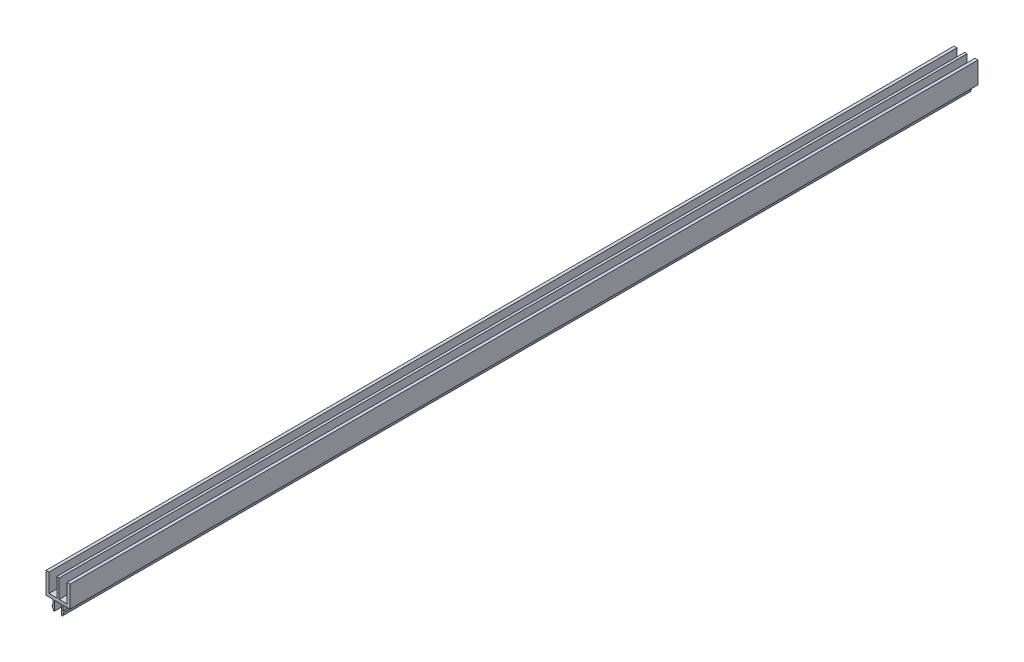
ISO-10303-21;
HEADER;
FILE_DESCRIPTION(('STEP AP214'),'2;1');
FILE_NAME('part.step','',(''),(''),'','','');
FILE_SCHEMA(('AUTOMOTIVE_DESIGN { 1 0 10303 214 1 1 1 1 }'));
ENDSEC;
DATA;
#1=APPLICATION_CONTEXT('core data for automotive mechanical design processes');
#2=APPLICATION_PROTOCOL_DEFINITION('international standard','automotive_design',2000,#1);
#3=PRODUCT_CONTEXT('',#1,'mechanical');
#4=PRODUCT('Part','Part','',(#3));
#5=PRODUCT_RELATED_PRODUCT_CATEGORY('part','',(#4));
#6=PRODUCT_DEFINITION_FORMATION('','',#4);
#7=PRODUCT_DEFINITION_CONTEXT('part definition',#1,'design');
#8=PRODUCT_DEFINITION('design','',#6,#7);
#9=PRODUCT_DEFINITION_SHAPE('','',#8);
#10=(LENGTH_UNIT() NAMED_UNIT(*) SI_UNIT(.MILLI.,.METRE.));
#11=(NAMED_UNIT(*) PLANE_ANGLE_UNIT() SI_UNIT($,.RADIAN.));
#12=(NAMED_UNIT(*) SI_UNIT($,.STERADIAN.) SOLID_ANGLE_UNIT());
#13=UNCERTAINTY_MEASURE_WITH_UNIT(LENGTH_MEASURE(1.E-05),#10,'distance_accuracy_value','');
#14=(GEOMETRIC_REPRESENTATION_CONTEXT(3) GLOBAL_UNCERTAINTY_ASSIGNED_CONTEXT((#13)) GLOBAL_UNIT_ASSIGNED_CONTEXT((#10,
#11,#12)) REPRESENTATION_CONTEXT('',''));
#15=CARTESIAN_POINT('',(0.,0.,0.));
#16=DIRECTION('',(0.,0.,1.));
#17=DIRECTION('',(1.,0.,0.));
#18=AXIS2_PLACEMENT_3D('',#15,#16,#17);
#19=CARTESIAN_POINT('',(-1.,17.9999999975,-706.));
#20=DIRECTION('',(-1.,0.,0.));
#21=DIRECTION('',(0.,-1.,0.));
#22=AXIS2_PLACEMENT_3D('',#19,#20,#21);
#23=PLANE('',#22);
#24=DIRECTION('',(0.,-1.,0.));
#25=VECTOR('',#24,1.);
#26=CARTESIAN_POINT('',(-1.,17.9999999975,50.));
#27=LINE('',#26,#25);
#28=CARTESIAN_POINT('',(-1.,17.9999999975,50.));
#29=VERTEX_POINT('',#28);
#30=CARTESIAN_POINT('',(-1.,2.4999999995,50.));
#31=VERTEX_POINT('',#30);
#32=EDGE_CURVE('E226',#29,#31,#27,.T.);
#33=ORIENTED_EDGE('',*,*,#32,.F.);
#34=DIRECTION('',(0.,0.,1.));
#35=VECTOR('',#34,1.);
#36=CARTESIAN_POINT('',(-1.,17.9999999975,-706.));
#37=LINE('',#36,#35);
#38=CARTESIAN_POINT('',(-1.,17.9999999975,-706.));
#39=VERTEX_POINT('',#38);
#40=EDGE_CURVE('E11',#39,#29,#37,.T.);
#41=ORIENTED_EDGE('',*,*,#40,.F.);
#42=DIRECTION('',(0.,-1.,0.));
#43=VECTOR('',#42,1.);
#44=CARTESIAN_POINT('',(-1.,17.9999999975,-706.));
#45=LINE('',#44,#43);
#46=CARTESIAN_POINT('',(-1.,2.4999999995,-706.));
#47=VERTEX_POINT('',#46);
#48=EDGE_CURVE('E294',#39,#47,#45,.T.);
#49=ORIENTED_EDGE('',*,*,#48,.T.);
#50=DIRECTION('',(0.,0.,1.));
#51=VECTOR('',#50,1.);
#52=CARTESIAN_POINT('',(-1.,2.4999999995,-706.));
#53=LINE('',#52,#51);
#54=EDGE_CURVE('E36',#47,#31,#53,.T.);
#55=ORIENTED_EDGE('',*,*,#54,.T.);
#56=EDGE_LOOP('',(#33,#41,#49,#55));
#57=FACE_BOUND('',#56,.T.);
#58=ADVANCED_FACE('F33',(#57),#23,.T.);
#59=CARTESIAN_POINT('',(0.999999999999998,17.9999999975,-706.));
#60=DIRECTION('',(0.,1.,0.));
#61=DIRECTION('',(0.,0.,1.));
#62=AXIS2_PLACEMENT_3D('',#59,#60,#61);
#63=PLANE('',#62);
#64=DIRECTION('',(-1.,0.,0.));
#65=VECTOR('',#64,1.);
#66=CARTESIAN_POINT('',(0.999999999999998,17.9999999975,50.));
#67=LINE('',#66,#65);
#68=CARTESIAN_POINT('',(0.999999999999998,17.9999999975,50.));
#69=VERTEX_POINT('',#68);
#70=EDGE_CURVE('E292',#69,#29,#67,.T.);
#71=ORIENTED_EDGE('',*,*,#70,.F.);
#72=DIRECTION('',(0.,0.,1.));
#73=VECTOR('',#72,1.);
#74=CARTESIAN_POINT('',(0.999999999999998,17.9999999975,-706.));
#75=LINE('',#74,#73);
#76=CARTESIAN_POINT('',(0.999999999999998,17.9999999975,-706.));
#77=VERTEX_POINT('',#76);
#78=EDGE_CURVE('E42',#77,#69,#75,.T.);
#79=ORIENTED_EDGE('',*,*,#78,.F.);
#80=DIRECTION('',(-1.,0.,0.));
#81=VECTOR('',#80,1.);
#82=CARTESIAN_POINT('',(0.999999999999998,17.9999999975,-706.));
#83=LINE('',#82,#81);
#84=EDGE_CURVE('E216',#77,#39,#83,.T.);
#85=ORIENTED_EDGE('',*,*,#84,.T.);
#86=ORIENTED_EDGE('',*,*,#40,.T.);
#87=EDGE_LOOP('',(#71,#79,#85,#86));
#88=FACE_BOUND('',#87,.T.);
#89=ADVANCED_FACE('F338',(#88),#63,.T.);
#90=CARTESIAN_POINT('',(0.999999999999998,2.4999999995,-706.));
#91=DIRECTION('',(1.,0.,0.));
#92=DIRECTION('',(0.,0.,-1.));
#93=AXIS2_PLACEMENT_3D('',#90,#91,#92);
#94=PLANE('',#93);
#95=DIRECTION('',(0.,1.,0.));
#96=VECTOR('',#95,1.);
#97=CARTESIAN_POINT('',(0.999999999999998,2.4999999995,50.));
#98=LINE('',#97,#96);
#99=CARTESIAN_POINT('',(0.999999999999998,2.4999999995,50.));
#100=VERTEX_POINT('',#99);
#101=EDGE_CURVE('E203',#100,#69,#98,.T.);
#102=ORIENTED_EDGE('',*,*,#101,.F.);
#103=DIRECTION('',(0.,0.,1.));
#104=VECTOR('',#103,1.);
#105=CARTESIAN_POINT('',(0.999999999999998,2.4999999995,-706.));
#106=LINE('',#105,#104);
#107=CARTESIAN_POINT('',(0.999999999999998,2.4999999995,-706.));
#108=VERTEX_POINT('',#107);
#109=EDGE_CURVE('E198',#108,#100,#106,.T.);
#110=ORIENTED_EDGE('',*,*,#109,.F.);
#111=DIRECTION('',(0.,1.,0.));
#112=VECTOR('',#111,1.);
#113=CARTESIAN_POINT('',(0.999999999999998,2.4999999995,-706.));
#114=LINE('',#113,#112);
#115=EDGE_CURVE('E201',#108,#77,#114,.T.);
#116=ORIENTED_EDGE('',*,*,#115,.T.);
#117=ORIENTED_EDGE('',*,*,#78,.T.);
#118=EDGE_LOOP('',(#102,#110,#116,#117));
#119=FACE_BOUND('',#118,.T.);
#120=ADVANCED_FACE('F200',(#119),#94,.T.);
#121=CARTESIAN_POINT('',(7.5,2.4999999995,-706.));
#122=DIRECTION('',(0.,1.,0.));
#123=DIRECTION('',(-1.,0.,0.));
#124=AXIS2_PLACEMENT_3D('',#121,#122,#123);
#125=PLANE('',#124);
#126=DIRECTION('',(-1.,0.,0.));
#127=VECTOR('',#126,1.);
#128=CARTESIAN_POINT('',(7.5,2.4999999995,50.));
#129=LINE('',#128,#127);
#130=CARTESIAN_POINT('',(7.5,2.4999999995,50.));
#131=VERTEX_POINT('',#130);
#132=EDGE_CURVE('E289',#131,#100,#129,.T.);
#133=ORIENTED_EDGE('',*,*,#132,.F.);
#134=DIRECTION('',(0.,0.,1.));
#135=VECTOR('',#134,1.);
#136=CARTESIAN_POINT('',(7.5,2.4999999995,-706.));
#137=LINE('',#136,#135);
#138=CARTESIAN_POINT('',(7.5,2.4999999995,-706.));
#139=VERTEX_POINT('',#138);
#140=EDGE_CURVE('E208',#139,#131,#137,.T.);
#141=ORIENTED_EDGE('',*,*,#140,.F.);
#142=DIRECTION('',(-1.,0.,0.));
#143=VECTOR('',#142,1.);
#144=CARTESIAN_POINT('',(7.5,2.4999999995,-706.));
#145=LINE('',#144,#143);
#146=EDGE_CURVE('E214',#139,#108,#145,.T.);
#147=ORIENTED_EDGE('',*,*,#146,.T.);
#148=ORIENTED_EDGE('',*,*,#109,.T.);
#149=EDGE_LOOP('',(#133,#141,#147,#148));
#150=FACE_BOUND('',#149,.T.);
#151=ADVANCED_FACE('F218',(#150),#125,.T.);
#152=CARTESIAN_POINT('',(7.5,17.9999999975,-706.));
#153=DIRECTION('',(-1.,0.,0.));
#154=DIRECTION('',(0.,-1.,0.));
#155=AXIS2_PLACEMENT_3D('',#152,#153,#154);
#156=PLANE('',#155);
#157=DIRECTION('',(0.,-1.,0.));
#158=VECTOR('',#157,1.);
#159=CARTESIAN_POINT('',(7.5,17.9999999975,50.));
#160=LINE('',#159,#158);
#161=CARTESIAN_POINT('',(7.5,17.9999999975,50.));
#162=VERTEX_POINT('',#161);
#163=EDGE_CURVE('E286',#162,#131,#160,.T.);
#164=ORIENTED_EDGE('',*,*,#163,.F.);
#165=DIRECTION('',(0.,0.,1.));
#166=VECTOR('',#165,1.);
#167=CARTESIAN_POINT('',(7.5,17.9999999975,-706.));
#168=LINE('',#167,#166);
#169=CARTESIAN_POINT('',(7.5,17.9999999975,-706.));
#170=VERTEX_POINT('',#169);
#171=EDGE_CURVE('E298',#170,#162,#168,.T.);
#172=ORIENTED_EDGE('',*,*,#171,.F.);
#173=DIRECTION('',(0.,-1.,0.));
#174=VECTOR('',#173,1.);
#175=CARTESIAN_POINT('',(7.5,17.9999999975,-706.));
#176=LINE('',#175,#174);
#177=EDGE_CURVE('E219',#170,#139,#176,.T.);
#178=ORIENTED_EDGE('',*,*,#177,.T.);
#179=ORIENTED_EDGE('',*,*,#140,.T.);
#180=EDGE_LOOP('',(#164,#172,#178,#179));
#181=FACE_BOUND('',#180,.T.);
#182=ADVANCED_FACE('F351',(#181),#156,.T.);
#183=CARTESIAN_POINT('',(10.,17.9999999975,-706.));
#184=DIRECTION('',(0.,1.,0.));
#185=DIRECTION('',(0.,0.,1.));
#186=AXIS2_PLACEMENT_3D('',#183,#184,#185);
#187=PLANE('',#186);
#188=DIRECTION('',(-1.,0.,0.));
#189=VECTOR('',#188,1.);
#190=CARTESIAN_POINT('',(10.,17.9999999975,50.));
#191=LINE('',#190,#189);
#192=CARTESIAN_POINT('',(10.,17.9999999975,50.));
#193=VERTEX_POINT('',#192);
#194=EDGE_CURVE('E283',#193,#162,#191,.T.);
#195=ORIENTED_EDGE('',*,*,#194,.F.);
#196=DIRECTION('',(0.,0.,1.));
#197=VECTOR('',#196,1.);
#198=CARTESIAN_POINT('',(10.,17.9999999975,-706.));
#199=LINE('',#198,#197);
#200=CARTESIAN_POINT('',(10.,17.9999999975,-706.));
#201=VERTEX_POINT('',#200);
#202=EDGE_CURVE('E300',#201,#193,#199,.T.);
#203=ORIENTED_EDGE('',*,*,#202,.F.);
#204=DIRECTION('',(-1.,0.,0.));
#205=VECTOR('',#204,1.);
#206=CARTESIAN_POINT('',(10.,17.9999999975,-706.));
#207=LINE('',#206,#205);
#208=EDGE_CURVE('E221',#201,#170,#207,.T.);
#209=ORIENTED_EDGE('',*,*,#208,.T.);
#210=ORIENTED_EDGE('',*,*,#171,.T.);
#211=EDGE_LOOP('',(#195,#203,#209,#210));
#212=FACE_BOUND('',#211,.T.);
#213=ADVANCED_FACE('F354',(#212),#187,.T.);
#214=CARTESIAN_POINT('',(10.,-4.99999828349541E-10,-706.));
#215=DIRECTION('',(1.,0.,0.));
#216=DIRECTION('',(0.,0.,-1.));
#217=AXIS2_PLACEMENT_3D('',#214,#215,#216);
#218=PLANE('',#217);
#219=DIRECTION('',(0.,1.,0.));
#220=VECTOR('',#219,1.);
#221=CARTESIAN_POINT('',(10.,-4.99999828349541E-10,50.));
#222=LINE('',#221,#220);
#223=CARTESIAN_POINT('',(10.,-4.99999828349541E-10,50.));
#224=VERTEX_POINT('',#223);
#225=EDGE_CURVE('E280',#224,#193,#222,.T.);
#226=ORIENTED_EDGE('',*,*,#225,.F.);
#227=DIRECTION('',(0.,0.,1.));
#228=VECTOR('',#227,1.);
#229=CARTESIAN_POINT('',(10.,-4.99999828349541E-10,-706.));
#230=LINE('',#229,#228);
#231=CARTESIAN_POINT('',(10.,-4.99999828349541E-10,-706.));
#232=VERTEX_POINT('',#231);
#233=EDGE_CURVE('E302',#232,#224,#230,.T.);
#234=ORIENTED_EDGE('',*,*,#233,.F.);
#235=DIRECTION('',(0.,1.,0.));
#236=VECTOR('',#235,1.);
#237=CARTESIAN_POINT('',(10.,-4.99999828349541E-10,-706.));
#238=LINE('',#237,#236);
#239=EDGE_CURVE('E644',#232,#201,#238,.T.);
#240=ORIENTED_EDGE('',*,*,#239,.T.);
#241=ORIENTED_EDGE('',*,*,#202,.T.);
#242=EDGE_LOOP('',(#226,#234,#240,#241));
#243=FACE_BOUND('',#242,.T.);
#244=ADVANCED_FACE('F358',(#243),#218,.T.);
#245=CARTESIAN_POINT('',(4.,-4.99999998002099E-10,-706.));
#246=DIRECTION('',(0.,-1.,0.));
#247=DIRECTION('',(1.,0.,0.));
#248=AXIS2_PLACEMENT_3D('',#245,#246,#247);
#249=PLANE('',#248);
#250=DIRECTION('',(1.,0.,0.));
#251=VECTOR('',#250,1.);
#252=CARTESIAN_POINT('',(4.,-4.99999998002099E-10,50.));
#253=LINE('',#252,#251);
#254=CARTESIAN_POINT('',(4.,-4.99999998002099E-10,50.));
#255=VERTEX_POINT('',#254);
#256=EDGE_CURVE('E277',#255,#224,#253,.T.);
#257=ORIENTED_EDGE('',*,*,#256,.F.);
#258=DIRECTION('',(0.,0.,1.));
#259=VECTOR('',#258,1.);
#260=CARTESIAN_POINT('',(4.,-4.99999998002099E-10,-706.));
#261=LINE('',#260,#259);
#262=CARTESIAN_POINT('',(4.,-4.99999998002099E-10,-706.));
#263=VERTEX_POINT('',#262);
#264=EDGE_CURVE('E304',#263,#255,#261,.T.);
#265=ORIENTED_EDGE('',*,*,#264,.F.);
#266=DIRECTION('',(1.,0.,0.));
#267=VECTOR('',#266,1.);
#268=CARTESIAN_POINT('',(4.,-4.99999998002099E-10,-706.));
#269=LINE('',#268,#267);
#270=EDGE_CURVE('E648',#263,#232,#269,.T.);
#271=ORIENTED_EDGE('',*,*,#270,.T.);
#272=ORIENTED_EDGE('',*,*,#233,.T.);
#273=EDGE_LOOP('',(#257,#265,#271,#272));
#274=FACE_BOUND('',#273,.T.);
#275=ADVANCED_FACE('F362',(#274),#249,.T.);
#276=CARTESIAN_POINT('',(4.,-4.5,-706.));
#277=DIRECTION('',(1.,0.,0.));
#278=DIRECTION('',(0.,0.,-1.));
#279=AXIS2_PLACEMENT_3D('',#276,#277,#278);
#280=PLANE('',#279);
#281=DIRECTION('',(0.,1.,0.));
#282=VECTOR('',#281,1.);
#283=CARTESIAN_POINT('',(4.,-4.5,50.));
#284=LINE('',#283,#282);
#285=CARTESIAN_POINT('',(4.,-4.5,50.));
#286=VERTEX_POINT('',#285);
#287=EDGE_CURVE('E274',#286,#255,#284,.T.);
#288=ORIENTED_EDGE('',*,*,#287,.F.);
#289=DIRECTION('',(0.,0.,1.));
#290=VECTOR('',#289,1.);
#291=CARTESIAN_POINT('',(4.,-4.5,-706.));
#292=LINE('',#291,#290);
#293=CARTESIAN_POINT('',(4.,-4.5,-706.));
#294=VERTEX_POINT('',#293);
#295=EDGE_CURVE('E306',#294,#286,#292,.T.);
#296=ORIENTED_EDGE('',*,*,#295,.F.);
#297=DIRECTION('',(0.,1.,0.));
#298=VECTOR('',#297,1.);
#299=CARTESIAN_POINT('',(4.,-4.5,-706.));
#300=LINE('',#299,#298);
#301=EDGE_CURVE('E637',#294,#263,#300,.T.);
#302=ORIENTED_EDGE('',*,*,#301,.T.);
#303=ORIENTED_EDGE('',*,*,#264,.T.);
#304=EDGE_LOOP('',(#288,#296,#302,#303));
#305=FACE_BOUND('',#304,.T.);
#306=ADVANCED_FACE('F366',(#305),#280,.T.);
#307=CARTESIAN_POINT('',(5.,-4.5,-706.));
#308=DIRECTION('',(0.,1.,0.));
#309=DIRECTION('',(0.,0.,1.));
#310=AXIS2_PLACEMENT_3D('',#307,#308,#309);
#311=PLANE('',#310);
#312=DIRECTION('',(-1.,0.,0.));
#313=VECTOR('',#312,1.);
#314=CARTESIAN_POINT('',(5.,-4.5,50.));
#315=LINE('',#314,#313);
#316=CARTESIAN_POINT('',(5.,-4.5,50.));
#317=VERTEX_POINT('',#316);
#318=EDGE_CURVE('E271',#317,#286,#315,.T.);
#319=ORIENTED_EDGE('',*,*,#318,.F.);
#320=DIRECTION('',(0.,0.,1.));
#321=VECTOR('',#320,1.);
#322=CARTESIAN_POINT('',(5.,-4.5,-706.));
#323=LINE('',#322,#321);
#324=CARTESIAN_POINT('',(5.,-4.5,-706.));
#325=VERTEX_POINT('',#324);
#326=EDGE_CURVE('E308',#325,#317,#323,.T.);
#327=ORIENTED_EDGE('',*,*,#326,.F.);
#328=DIRECTION('',(-1.,0.,0.));
#329=VECTOR('',#328,1.);
#330=CARTESIAN_POINT('',(5.,-4.5,-706.));
#331=LINE('',#330,#329);
#332=EDGE_CURVE('E633',#325,#294,#331,.T.);
#333=ORIENTED_EDGE('',*,*,#332,.T.);
#334=ORIENTED_EDGE('',*,*,#295,.T.);
#335=EDGE_LOOP('',(#319,#327,#333,#334));
#336=FACE_BOUND('',#335,.T.);
#337=ADVANCED_FACE('F370',(#336),#311,.T.);
#338=CARTESIAN_POINT('',(3.75,-8.,-706.));
#339=DIRECTION('',(0.941741911594837,-0.336336396998156,0.));
#340=DIRECTION('',(0.336336396998157,0.941741911594838,0.));
#341=AXIS2_PLACEMENT_3D('',#338,#339,#340);
#342=PLANE('',#341);
#343=DIRECTION('',(0.336336396998157,0.941741911594837,0.));
#344=VECTOR('',#343,1.);
#345=CARTESIAN_POINT('',(3.75,-8.,50.));
#346=LINE('',#345,#344);
#347=CARTESIAN_POINT('',(3.75,-8.,50.));
#348=VERTEX_POINT('',#347);
#349=EDGE_CURVE('E268',#348,#317,#346,.T.);
#350=ORIENTED_EDGE('',*,*,#349,.F.);
#351=DIRECTION('',(0.,0.,1.));
#352=VECTOR('',#351,1.);
#353=CARTESIAN_POINT('',(3.75,-8.,-706.));
#354=LINE('',#353,#352);
#355=CARTESIAN_POINT('',(3.75,-8.,-706.));
#356=VERTEX_POINT('',#355);
#357=EDGE_CURVE('E310',#356,#348,#354,.T.);
#358=ORIENTED_EDGE('',*,*,#357,.F.);
#359=DIRECTION('',(0.336336396998157,0.941741911594837,0.));
#360=VECTOR('',#359,1.);
#361=CARTESIAN_POINT('',(3.75,-8.,-706.));
#362=LINE('',#361,#360);
#363=EDGE_CURVE('E654',#356,#325,#362,.T.);
#364=ORIENTED_EDGE('',*,*,#363,.T.);
#365=ORIENTED_EDGE('',*,*,#326,.T.);
#366=EDGE_LOOP('',(#350,#358,#364,#365));
#367=FACE_BOUND('',#366,.T.);
#368=ADVANCED_FACE('F374',(#367),#342,.T.);
#369=CARTESIAN_POINT('',(3.,-8.,-706.));
#370=DIRECTION('',(0.,-1.,0.));
#371=DIRECTION('',(0.,0.,-1.));
#372=AXIS2_PLACEMENT_3D('',#369,#370,#371);
#373=PLANE('',#372);
#374=DIRECTION('',(1.,0.,0.));
#375=VECTOR('',#374,1.);
#376=CARTESIAN_POINT('',(3.,-8.,50.));
#377=LINE('',#376,#375);
#378=CARTESIAN_POINT('',(3.,-8.,50.));
#379=VERTEX_POINT('',#378);
#380=EDGE_CURVE('E265',#379,#348,#377,.T.);
#381=ORIENTED_EDGE('',*,*,#380,.F.);
#382=DIRECTION('',(0.,0.,1.));
#383=VECTOR('',#382,1.);
#384=CARTESIAN_POINT('',(3.,-8.,-706.));
#385=LINE('',#384,#383);
#386=CARTESIAN_POINT('',(3.,-8.,-706.));
#387=VERTEX_POINT('',#386);
#388=EDGE_CURVE('E312',#387,#379,#385,.T.);
#389=ORIENTED_EDGE('',*,*,#388,.F.);
#390=DIRECTION('',(1.,0.,0.));
#391=VECTOR('',#390,1.);
#392=CARTESIAN_POINT('',(3.,-8.,-706.));
#393=LINE('',#392,#391);
#394=EDGE_CURVE('E626',#387,#356,#393,.T.);
#395=ORIENTED_EDGE('',*,*,#394,.T.);
#396=ORIENTED_EDGE('',*,*,#357,.T.);
#397=EDGE_LOOP('',(#381,#389,#395,#396));
#398=FACE_BOUND('',#397,.T.);
#399=ADVANCED_FACE('F378',(#398),#373,.T.);
#400=CARTESIAN_POINT('',(3.,-4.9999985194348E-10,-706.));
#401=DIRECTION('',(-1.,0.,0.));
#402=DIRECTION('',(0.,0.,1.));
#403=AXIS2_PLACEMENT_3D('',#400,#401,#402);
#404=PLANE('',#403);
#405=DIRECTION('',(0.,-1.,0.));
#406=VECTOR('',#405,1.);
#407=CARTESIAN_POINT('',(3.,-4.9999985194348E-10,50.));
#408=LINE('',#407,#406);
#409=CARTESIAN_POINT('',(3.,-4.9999985194348E-10,50.));
#410=VERTEX_POINT('',#409);
#411=EDGE_CURVE('E262',#410,#379,#408,.T.);
#412=ORIENTED_EDGE('',*,*,#411,.F.);
#413=DIRECTION('',(0.,0.,1.));
#414=VECTOR('',#413,1.);
#415=CARTESIAN_POINT('',(3.,-4.9999985194348E-10,-706.));
#416=LINE('',#415,#414);
#417=CARTESIAN_POINT('',(3.,-4.9999985194348E-10,-706.));
#418=VERTEX_POINT('',#417);
#419=EDGE_CURVE('E314',#418,#410,#416,.T.);
#420=ORIENTED_EDGE('',*,*,#419,.F.);
#421=DIRECTION('',(0.,-1.,0.));
#422=VECTOR('',#421,1.);
#423=CARTESIAN_POINT('',(3.,-4.9999985194348E-10,-706.));
#424=LINE('',#423,#422);
#425=EDGE_CURVE('E622',#418,#387,#424,.T.);
#426=ORIENTED_EDGE('',*,*,#425,.T.);
#427=ORIENTED_EDGE('',*,*,#388,.T.);
#428=EDGE_LOOP('',(#412,#420,#426,#427));
#429=FACE_BOUND('',#428,.T.);
#430=ADVANCED_FACE('F382',(#429),#404,.T.);
#431=CARTESIAN_POINT('',(-3.,-4.99999455901012E-10,-706.));
#432=DIRECTION('',(0.,-1.,0.));
#433=DIRECTION('',(1.,0.,0.));
#434=AXIS2_PLACEMENT_3D('',#431,#432,#433);
#435=PLANE('',#434);
#436=DIRECTION('',(1.,0.,0.));
#437=VECTOR('',#436,1.);
#438=CARTESIAN_POINT('',(-3.,-4.99999455901012E-10,50.));
#439=LINE('',#438,#437);
#440=CARTESIAN_POINT('',(-3.,-4.99999455901012E-10,50.));
#441=VERTEX_POINT('',#440);
#442=EDGE_CURVE('E259',#441,#410,#439,.T.);
#443=ORIENTED_EDGE('',*,*,#442,.F.);
#444=DIRECTION('',(0.,0.,1.));
#445=VECTOR('',#444,1.);
#446=CARTESIAN_POINT('',(-3.,-4.99999455901012E-10,-706.));
#447=LINE('',#446,#445);
#448=CARTESIAN_POINT('',(-3.,-4.99999455901012E-10,-706.));
#449=VERTEX_POINT('',#448);
#450=EDGE_CURVE('E316',#449,#441,#447,.T.);
#451=ORIENTED_EDGE('',*,*,#450,.F.);
#452=DIRECTION('',(1.,0.,0.));
#453=VECTOR('',#452,1.);
#454=CARTESIAN_POINT('',(-3.,-4.99999455901012E-10,-706.));
#455=LINE('',#454,#453);
#456=EDGE_CURVE('E658',#449,#418,#455,.T.);
#457=ORIENTED_EDGE('',*,*,#456,.T.);
#458=ORIENTED_EDGE('',*,*,#419,.T.);
#459=EDGE_LOOP('',(#443,#451,#457,#458));
#460=FACE_BOUND('',#459,.T.);
#461=ADVANCED_FACE('F386',(#460),#435,.T.);
#462=CARTESIAN_POINT('',(-3.,-8.,-706.));
#463=DIRECTION('',(1.,0.,0.));
#464=DIRECTION('',(0.,0.,-1.));
#465=AXIS2_PLACEMENT_3D('',#462,#463,#464);
#466=PLANE('',#465);
#467=DIRECTION('',(0.,1.,0.));
#468=VECTOR('',#467,1.);
#469=CARTESIAN_POINT('',(-3.,-8.,50.));
#470=LINE('',#469,#468);
#471=CARTESIAN_POINT('',(-3.,-8.,50.));
#472=VERTEX_POINT('',#471);
#473=EDGE_CURVE('E256',#472,#441,#470,.T.);
#474=ORIENTED_EDGE('',*,*,#473,.F.);
#475=DIRECTION('',(0.,0.,1.));
#476=VECTOR('',#475,1.);
#477=CARTESIAN_POINT('',(-3.,-8.,-706.));
#478=LINE('',#477,#476);
#479=CARTESIAN_POINT('',(-3.,-8.,-706.));
#480=VERTEX_POINT('',#479);
#481=EDGE_CURVE('E318',#480,#472,#478,.T.);
#482=ORIENTED_EDGE('',*,*,#481,.F.);
#483=DIRECTION('',(0.,1.,0.));
#484=VECTOR('',#483,1.);
#485=CARTESIAN_POINT('',(-3.,-8.,-706.));
#486=LINE('',#485,#484);
#487=EDGE_CURVE('E615',#480,#449,#486,.T.);
#488=ORIENTED_EDGE('',*,*,#487,.T.);
#489=ORIENTED_EDGE('',*,*,#450,.T.);
#490=EDGE_LOOP('',(#474,#482,#488,#489));
#491=FACE_BOUND('',#490,.T.);
#492=ADVANCED_FACE('F390',(#491),#466,.T.);
#493=CARTESIAN_POINT('',(-3.75,-8.,-706.));
#494=DIRECTION('',(0.,-1.,0.));
#495=DIRECTION('',(0.,0.,-1.));
#496=AXIS2_PLACEMENT_3D('',#493,#494,#495);
#497=PLANE('',#496);
#498=DIRECTION('',(1.,0.,0.));
#499=VECTOR('',#498,1.);
#500=CARTESIAN_POINT('',(-3.75,-8.,50.));
#501=LINE('',#500,#499);
#502=CARTESIAN_POINT('',(-3.75,-8.,50.));
#503=VERTEX_POINT('',#502);
#504=EDGE_CURVE('E253',#503,#472,#501,.T.);
#505=ORIENTED_EDGE('',*,*,#504,.F.);
#506=DIRECTION('',(0.,0.,1.));
#507=VECTOR('',#506,1.);
#508=CARTESIAN_POINT('',(-3.75,-8.,-706.));
#509=LINE('',#508,#507);
#510=CARTESIAN_POINT('',(-3.75,-8.,-706.));
#511=VERTEX_POINT('',#510);
#512=EDGE_CURVE('E320',#511,#503,#509,.T.);
#513=ORIENTED_EDGE('',*,*,#512,.F.);
#514=DIRECTION('',(1.,0.,0.));
#515=VECTOR('',#514,1.);
#516=CARTESIAN_POINT('',(-3.75,-8.,-706.));
#517=LINE('',#516,#515);
#518=EDGE_CURVE('E611',#511,#480,#517,.T.);
#519=ORIENTED_EDGE('',*,*,#518,.T.);
#520=ORIENTED_EDGE('',*,*,#481,.T.);
#521=EDGE_LOOP('',(#505,#513,#519,#520));
#522=FACE_BOUND('',#521,.T.);
#523=ADVANCED_FACE('F394',(#522),#497,.T.);
#524=CARTESIAN_POINT('',(-5.,-4.5,-706.));
#525=DIRECTION('',(-0.941741911594837,-0.336336396998156,0.));
#526=DIRECTION('',(0.336336396998156,-0.941741911594838,0.));
#527=AXIS2_PLACEMENT_3D('',#524,#525,#526);
#528=PLANE('',#527);
#529=DIRECTION('',(0.336336396998156,-0.941741911594837,0.));
#530=VECTOR('',#529,1.);
#531=CARTESIAN_POINT('',(-5.,-4.5,50.));
#532=LINE('',#531,#530);
#533=CARTESIAN_POINT('',(-5.,-4.5,50.));
#534=VERTEX_POINT('',#533);
#535=EDGE_CURVE('E250',#534,#503,#532,.T.);
#536=ORIENTED_EDGE('',*,*,#535,.F.);
#537=DIRECTION('',(0.,0.,1.));
#538=VECTOR('',#537,1.);
#539=CARTESIAN_POINT('',(-5.,-4.5,-706.));
#540=LINE('',#539,#538);
#541=CARTESIAN_POINT('',(-5.,-4.5,-706.));
#542=VERTEX_POINT('',#541);
#543=EDGE_CURVE('E322',#542,#534,#540,.T.);
#544=ORIENTED_EDGE('',*,*,#543,.F.);
#545=DIRECTION('',(0.336336396998156,-0.941741911594837,0.));
#546=VECTOR('',#545,1.);
#547=CARTESIAN_POINT('',(-5.,-4.5,-706.));
#548=LINE('',#547,#546);
#549=EDGE_CURVE('E662',#542,#511,#548,.T.);
#550=ORIENTED_EDGE('',*,*,#549,.T.);
#551=ORIENTED_EDGE('',*,*,#512,.T.);
#552=EDGE_LOOP('',(#536,#544,#550,#551));
#553=FACE_BOUND('',#552,.T.);
#554=ADVANCED_FACE('F398',(#553),#528,.T.);
#555=CARTESIAN_POINT('',(-4.,-4.5,-706.));
#556=DIRECTION('',(0.,1.,0.));
#557=DIRECTION('',(0.,0.,1.));
#558=AXIS2_PLACEMENT_3D('',#555,#556,#557);
#559=PLANE('',#558);
#560=DIRECTION('',(-1.,0.,0.));
#561=VECTOR('',#560,1.);
#562=CARTESIAN_POINT('',(-4.,-4.5,50.));
#563=LINE('',#562,#561);
#564=CARTESIAN_POINT('',(-4.,-4.5,50.));
#565=VERTEX_POINT('',#564);
#566=EDGE_CURVE('E247',#565,#534,#563,.T.);
#567=ORIENTED_EDGE('',*,*,#566,.F.);
#568=DIRECTION('',(0.,0.,1.));
#569=VECTOR('',#568,1.);
#570=CARTESIAN_POINT('',(-4.,-4.5,-706.));
#571=LINE('',#570,#569);
#572=CARTESIAN_POINT('',(-4.,-4.5,-706.));
#573=VERTEX_POINT('',#572);
#574=EDGE_CURVE('E324',#573,#565,#571,.T.);
#575=ORIENTED_EDGE('',*,*,#574,.F.);
#576=DIRECTION('',(-1.,0.,0.));
#577=VECTOR('',#576,1.);
#578=CARTESIAN_POINT('',(-4.,-4.5,-706.));
#579=LINE('',#578,#577);
#580=EDGE_CURVE('E604',#573,#542,#579,.T.);
#581=ORIENTED_EDGE('',*,*,#580,.T.);
#582=ORIENTED_EDGE('',*,*,#543,.T.);
#583=EDGE_LOOP('',(#567,#575,#581,#582));
#584=FACE_BOUND('',#583,.T.);
#585=ADVANCED_FACE('F402',(#584),#559,.T.);
#586=CARTESIAN_POINT('',(-4.,-4.9999985194348E-10,-706.));
#587=DIRECTION('',(-1.,0.,0.));
#588=DIRECTION('',(0.,0.,1.));
#589=AXIS2_PLACEMENT_3D('',#586,#587,#588);
#590=PLANE('',#589);
#591=DIRECTION('',(0.,-1.,0.));
#592=VECTOR('',#591,1.);
#593=CARTESIAN_POINT('',(-4.,-4.9999985194348E-10,50.));
#594=LINE('',#593,#592);
#595=CARTESIAN_POINT('',(-4.,-4.9999985194348E-10,50.));
#596=VERTEX_POINT('',#595);
#597=EDGE_CURVE('E244',#596,#565,#594,.T.);
#598=ORIENTED_EDGE('',*,*,#597,.F.);
#599=DIRECTION('',(0.,0.,1.));
#600=VECTOR('',#599,1.);
#601=CARTESIAN_POINT('',(-4.,-4.9999985194348E-10,-706.));
#602=LINE('',#601,#600);
#603=CARTESIAN_POINT('',(-4.,-4.9999985194348E-10,-706.));
#604=VERTEX_POINT('',#603);
#605=EDGE_CURVE('E326',#604,#596,#602,.T.);
#606=ORIENTED_EDGE('',*,*,#605,.F.);
#607=DIRECTION('',(0.,-1.,0.));
#608=VECTOR('',#607,1.);
#609=CARTESIAN_POINT('',(-4.,-4.9999985194348E-10,-706.));
#610=LINE('',#609,#608);
#611=EDGE_CURVE('E600',#604,#573,#610,.T.);
#612=ORIENTED_EDGE('',*,*,#611,.T.);
#613=ORIENTED_EDGE('',*,*,#574,.T.);
#614=EDGE_LOOP('',(#598,#606,#612,#613));
#615=FACE_BOUND('',#614,.T.);
#616=ADVANCED_FACE('F406',(#615),#590,.T.);
#617=CARTESIAN_POINT('',(-10.,-4.99999719929324E-10,-706.));
#618=DIRECTION('',(0.,-1.,0.));
#619=DIRECTION('',(1.,0.,0.));
#620=AXIS2_PLACEMENT_3D('',#617,#618,#619);
#621=PLANE('',#620);
#622=DIRECTION('',(1.,0.,0.));
#623=VECTOR('',#622,1.);
#624=CARTESIAN_POINT('',(-10.,-4.99999719929324E-10,50.));
#625=LINE('',#624,#623);
#626=CARTESIAN_POINT('',(-10.,-4.99999719929324E-10,50.));
#627=VERTEX_POINT('',#626);
#628=EDGE_CURVE('E241',#627,#596,#625,.T.);
#629=ORIENTED_EDGE('',*,*,#628,.F.);
#630=DIRECTION('',(0.,0.,1.));
#631=VECTOR('',#630,1.);
#632=CARTESIAN_POINT('',(-10.,-4.99999719929324E-10,-706.));
#633=LINE('',#632,#631);
#634=CARTESIAN_POINT('',(-10.,-4.99999719929324E-10,-706.));
#635=VERTEX_POINT('',#634);
#636=EDGE_CURVE('E328',#635,#627,#633,.T.);
#637=ORIENTED_EDGE('',*,*,#636,.F.);
#638=DIRECTION('',(1.,0.,0.));
#639=VECTOR('',#638,1.);
#640=CARTESIAN_POINT('',(-10.,-4.99999719929324E-10,-706.));
#641=LINE('',#640,#639);
#642=EDGE_CURVE('E666',#635,#604,#641,.T.);
#643=ORIENTED_EDGE('',*,*,#642,.T.);
#644=ORIENTED_EDGE('',*,*,#605,.T.);
#645=EDGE_LOOP('',(#629,#637,#643,#644));
#646=FACE_BOUND('',#645,.T.);
#647=ADVANCED_FACE('F410',(#646),#621,.T.);
#648=CARTESIAN_POINT('',(-10.,17.9999999975,-706.));
#649=DIRECTION('',(-1.,0.,0.));
#650=DIRECTION('',(0.,-1.,0.));
#651=AXIS2_PLACEMENT_3D('',#648,#649,#650);
#652=PLANE('',#651);
#653=DIRECTION('',(0.,-1.,0.));
#654=VECTOR('',#653,1.);
#655=CARTESIAN_POINT('',(-10.,17.9999999975,50.));
#656=LINE('',#655,#654);
#657=CARTESIAN_POINT('',(-10.,17.9999999975,50.));
#658=VERTEX_POINT('',#657);
#659=EDGE_CURVE('E238',#658,#627,#656,.T.);
#660=ORIENTED_EDGE('',*,*,#659,.F.);
#661=DIRECTION('',(0.,0.,1.));
#662=VECTOR('',#661,1.);
#663=CARTESIAN_POINT('',(-10.,17.9999999975,-706.));
#664=LINE('',#663,#662);
#665=CARTESIAN_POINT('',(-10.,17.9999999975,-706.));
#666=VERTEX_POINT('',#665);
#667=EDGE_CURVE('E330',#666,#658,#664,.T.);
#668=ORIENTED_EDGE('',*,*,#667,.F.);
#669=DIRECTION('',(0.,-1.,0.));
#670=VECTOR('',#669,1.);
#671=CARTESIAN_POINT('',(-10.,17.9999999975,-706.));
#672=LINE('',#671,#670);
#673=EDGE_CURVE('E593',#666,#635,#672,.T.);
#674=ORIENTED_EDGE('',*,*,#673,.T.);
#675=ORIENTED_EDGE('',*,*,#636,.T.);
#676=EDGE_LOOP('',(#660,#668,#674,#675));
#677=FACE_BOUND('',#676,.T.);
#678=ADVANCED_FACE('F414',(#677),#652,.T.);
#679=CARTESIAN_POINT('',(-7.5,17.9999999975,-706.));
#680=DIRECTION('',(0.,1.,0.));
#681=DIRECTION('',(0.,0.,1.));
#682=AXIS2_PLACEMENT_3D('',#679,#680,#681);
#683=PLANE('',#682);
#684=DIRECTION('',(-1.,0.,0.));
#685=VECTOR('',#684,1.);
#686=CARTESIAN_POINT('',(-7.5,17.9999999975,50.));
#687=LINE('',#686,#685);
#688=CARTESIAN_POINT('',(-7.5,17.9999999975,50.));
#689=VERTEX_POINT('',#688);
#690=EDGE_CURVE('E235',#689,#658,#687,.T.);
#691=ORIENTED_EDGE('',*,*,#690,.F.);
#692=DIRECTION('',(0.,0.,1.));
#693=VECTOR('',#692,1.);
#694=CARTESIAN_POINT('',(-7.5,17.9999999975,-706.));
#695=LINE('',#694,#693);
#696=CARTESIAN_POINT('',(-7.5,17.9999999975,-706.));
#697=VERTEX_POINT('',#696);
#698=EDGE_CURVE('E332',#697,#689,#695,.T.);
#699=ORIENTED_EDGE('',*,*,#698,.F.);
#700=DIRECTION('',(-1.,0.,0.));
#701=VECTOR('',#700,1.);
#702=CARTESIAN_POINT('',(-7.5,17.9999999975,-706.));
#703=LINE('',#702,#701);
#704=EDGE_CURVE('E589',#697,#666,#703,.T.);
#705=ORIENTED_EDGE('',*,*,#704,.T.);
#706=ORIENTED_EDGE('',*,*,#667,.T.);
#707=EDGE_LOOP('',(#691,#699,#705,#706));
#708=FACE_BOUND('',#707,.T.);
#709=ADVANCED_FACE('F418',(#708),#683,.T.);
#710=CARTESIAN_POINT('',(-7.5,2.4999999995,-706.));
#711=DIRECTION('',(1.,0.,0.));
#712=DIRECTION('',(0.,0.,-1.));
#713=AXIS2_PLACEMENT_3D('',#710,#711,#712);
#714=PLANE('',#713);
#715=DIRECTION('',(0.,1.,0.));
#716=VECTOR('',#715,1.);
#717=CARTESIAN_POINT('',(-7.5,2.4999999995,50.));
#718=LINE('',#717,#716);
#719=CARTESIAN_POINT('',(-7.5,2.4999999995,50.));
#720=VERTEX_POINT('',#719);
#721=EDGE_CURVE('E232',#720,#689,#718,.T.);
#722=ORIENTED_EDGE('',*,*,#721,.F.);
#723=DIRECTION('',(0.,0.,1.));
#724=VECTOR('',#723,1.);
#725=CARTESIAN_POINT('',(-7.5,2.4999999995,-706.));
#726=LINE('',#725,#724);
#727=CARTESIAN_POINT('',(-7.5,2.4999999995,-706.));
#728=VERTEX_POINT('',#727);
#729=EDGE_CURVE('E333',#728,#720,#726,.T.);
#730=ORIENTED_EDGE('',*,*,#729,.F.);
#731=DIRECTION('',(0.,1.,0.));
#732=VECTOR('',#731,1.);
#733=CARTESIAN_POINT('',(-7.5,2.4999999995,-706.));
#734=LINE('',#733,#732);
#735=EDGE_CURVE('E670',#728,#697,#734,.T.);
#736=ORIENTED_EDGE('',*,*,#735,.T.);
#737=ORIENTED_EDGE('',*,*,#698,.T.);
#738=EDGE_LOOP('',(#722,#730,#736,#737));
#739=FACE_BOUND('',#738,.T.);
#740=ADVANCED_FACE('F422',(#739),#714,.T.);
#741=CARTESIAN_POINT('',(-1.,2.4999999995,-706.));
#742=DIRECTION('',(0.,1.,0.));
#743=DIRECTION('',(-1.,0.,0.));
#744=AXIS2_PLACEMENT_3D('',#741,#742,#743);
#745=PLANE('',#744);
#746=DIRECTION('',(-1.,0.,0.));
#747=VECTOR('',#746,1.);
#748=CARTESIAN_POINT('',(-1.,2.4999999995,50.));
#749=LINE('',#748,#747);
#750=EDGE_CURVE('E229',#31,#720,#749,.T.);
#751=ORIENTED_EDGE('',*,*,#750,.F.);
#752=ORIENTED_EDGE('',*,*,#54,.F.);
#753=DIRECTION('',(-1.,0.,0.));
#754=VECTOR('',#753,1.);
#755=CARTESIAN_POINT('',(-1.,2.4999999995,-706.));
#756=LINE('',#755,#754);
#757=EDGE_CURVE('E672',#47,#728,#756,.T.);
#758=ORIENTED_EDGE('',*,*,#757,.T.);
#759=ORIENTED_EDGE('',*,*,#729,.T.);
#760=EDGE_LOOP('',(#751,#752,#758,#759));
#761=FACE_BOUND('',#760,.T.);
#762=ADVANCED_FACE('F335',(#761),#745,.T.);
#763=CARTESIAN_POINT('',(0.,0.,-706.));
#764=DIRECTION('',(0.,0.,-1.));
#765=DIRECTION('',(-1.,0.,0.));
#766=AXIS2_PLACEMENT_3D('',#763,#764,#765);
#767=PLANE('',#766);
#768=ORIENTED_EDGE('',*,*,#48,.F.);
#769=ORIENTED_EDGE('',*,*,#84,.F.);
#770=ORIENTED_EDGE('',*,*,#115,.F.);
#771=ORIENTED_EDGE('',*,*,#146,.F.);
#772=ORIENTED_EDGE('',*,*,#177,.F.);
#773=ORIENTED_EDGE('',*,*,#208,.F.);
#774=ORIENTED_EDGE('',*,*,#239,.F.);
#775=ORIENTED_EDGE('',*,*,#270,.F.);
#776=ORIENTED_EDGE('',*,*,#301,.F.);
#777=ORIENTED_EDGE('',*,*,#332,.F.);
#778=ORIENTED_EDGE('',*,*,#363,.F.);
#779=ORIENTED_EDGE('',*,*,#394,.F.);
#780=ORIENTED_EDGE('',*,*,#425,.F.);
#781=ORIENTED_EDGE('',*,*,#456,.F.);
#782=ORIENTED_EDGE('',*,*,#487,.F.);
#783=ORIENTED_EDGE('',*,*,#518,.F.);
#784=ORIENTED_EDGE('',*,*,#549,.F.);
#785=ORIENTED_EDGE('',*,*,#580,.F.);
#786=ORIENTED_EDGE('',*,*,#611,.F.);
#787=ORIENTED_EDGE('',*,*,#642,.F.);
#788=ORIENTED_EDGE('',*,*,#673,.F.);
#789=ORIENTED_EDGE('',*,*,#704,.F.);
#790=ORIENTED_EDGE('',*,*,#735,.F.);
#791=ORIENTED_EDGE('',*,*,#757,.F.);
#792=EDGE_LOOP('',(#768,#769,#770,#771,#772,#773,#774,#775,#776,#777,#778,#779,#780,#781,#782,
#783,#784,#785,#786,#787,#788,#789,#790,#791));
#793=FACE_BOUND('',#792,.T.);
#794=ADVANCED_FACE('F212',(#793),#767,.T.);
#795=CARTESIAN_POINT('',(0.,0.,50.));
#796=DIRECTION('',(0.,0.,-1.));
#797=DIRECTION('',(-1.,0.,0.));
#798=AXIS2_PLACEMENT_3D('',#795,#796,#797);
#799=PLANE('',#798);
#800=ORIENTED_EDGE('',*,*,#32,.T.);
#801=ORIENTED_EDGE('',*,*,#750,.T.);
#802=ORIENTED_EDGE('',*,*,#721,.T.);
#803=ORIENTED_EDGE('',*,*,#690,.T.);
#804=ORIENTED_EDGE('',*,*,#659,.T.);
#805=ORIENTED_EDGE('',*,*,#628,.T.);
#806=ORIENTED_EDGE('',*,*,#597,.T.);
#807=ORIENTED_EDGE('',*,*,#566,.T.);
#808=ORIENTED_EDGE('',*,*,#535,.T.);
#809=ORIENTED_EDGE('',*,*,#504,.T.);
#810=ORIENTED_EDGE('',*,*,#473,.T.);
#811=ORIENTED_EDGE('',*,*,#442,.T.);
#812=ORIENTED_EDGE('',*,*,#411,.T.);
#813=ORIENTED_EDGE('',*,*,#380,.T.);
#814=ORIENTED_EDGE('',*,*,#349,.T.);
#815=ORIENTED_EDGE('',*,*,#318,.T.);
#816=ORIENTED_EDGE('',*,*,#287,.T.);
#817=ORIENTED_EDGE('',*,*,#256,.T.);
#818=ORIENTED_EDGE('',*,*,#225,.T.);
#819=ORIENTED_EDGE('',*,*,#194,.T.);
#820=ORIENTED_EDGE('',*,*,#163,.T.);
#821=ORIENTED_EDGE('',*,*,#132,.T.);
#822=ORIENTED_EDGE('',*,*,#101,.T.);
#823=ORIENTED_EDGE('',*,*,#70,.T.);
#824=EDGE_LOOP('',(#800,#801,#802,#803,#804,#805,#806,#807,#808,#809,#810,#811,#812,#813,#814,
#815,#816,#817,#818,#819,#820,#821,#822,#823));
#825=FACE_BOUND('',#824,.T.);
#826=ADVANCED_FACE('F337',(#825),#799,.F.);
#827=CLOSED_SHELL('',(#58,#89,#120,#151,#182,#213,#244,#275,#306,#337,#368,#399,#430,#461,#492,
#523,#554,#585,#616,#647,#678,#709,#740,#762,#794,#826));
#828=MANIFOLD_SOLID_BREP('B2',#827);
#829=ADVANCED_BREP_SHAPE_REPRESENTATION('',(#18,#828),#14);
#830=SHAPE_DEFINITION_REPRESENTATION(#9,#829);
ENDSEC;
END-ISO-10303-21;
